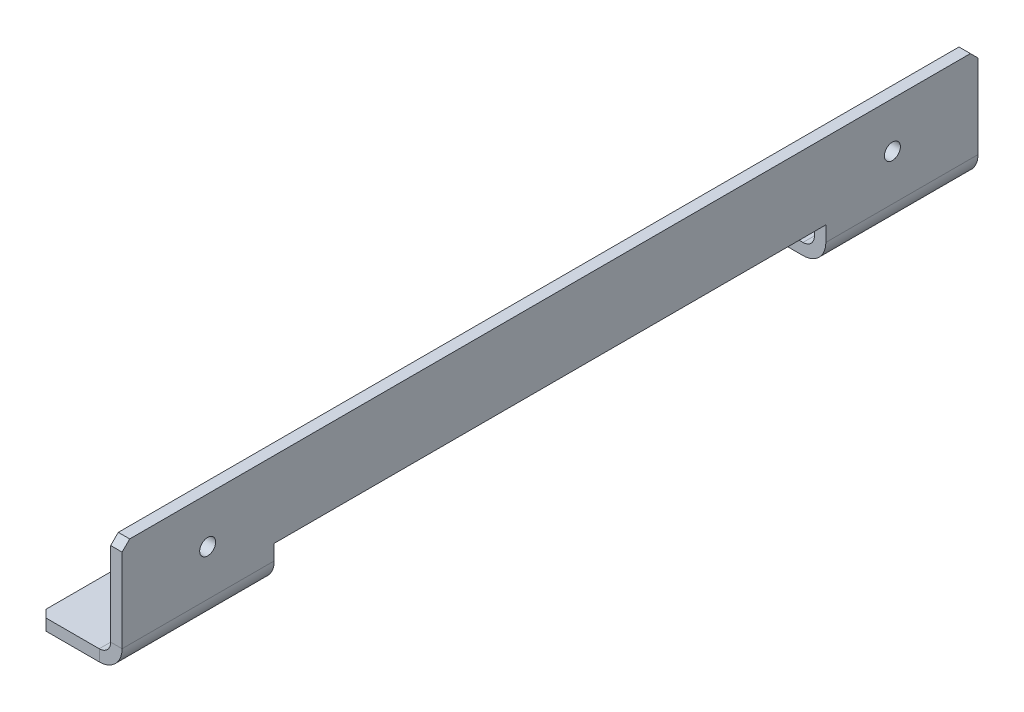
ISO-10303-21;
HEADER;
FILE_DESCRIPTION(('STEP AP214'),'2;1');
FILE_NAME('part.step','',(''),(''),'','','');
FILE_SCHEMA(('AUTOMOTIVE_DESIGN { 1 0 10303 214 1 1 1 1 }'));
ENDSEC;
DATA;
#1=APPLICATION_CONTEXT('core data for automotive mechanical design processes');
#2=APPLICATION_PROTOCOL_DEFINITION('international standard','automotive_design',2000,#1);
#3=PRODUCT_CONTEXT('',#1,'mechanical');
#4=PRODUCT('Part','Part','',(#3));
#5=PRODUCT_RELATED_PRODUCT_CATEGORY('part','',(#4));
#6=PRODUCT_DEFINITION_FORMATION('','',#4);
#7=PRODUCT_DEFINITION_CONTEXT('part definition',#1,'design');
#8=PRODUCT_DEFINITION('design','',#6,#7);
#9=PRODUCT_DEFINITION_SHAPE('','',#8);
#10=(LENGTH_UNIT() NAMED_UNIT(*) SI_UNIT(.MILLI.,.METRE.));
#11=(NAMED_UNIT(*) PLANE_ANGLE_UNIT() SI_UNIT($,.RADIAN.));
#12=(NAMED_UNIT(*) SI_UNIT($,.STERADIAN.) SOLID_ANGLE_UNIT());
#13=UNCERTAINTY_MEASURE_WITH_UNIT(LENGTH_MEASURE(1.E-05),#10,'distance_accuracy_value','');
#14=(GEOMETRIC_REPRESENTATION_CONTEXT(3) GLOBAL_UNCERTAINTY_ASSIGNED_CONTEXT((#13)) GLOBAL_UNIT_ASSIGNED_CONTEXT((#10,
#11,#12)) REPRESENTATION_CONTEXT('',''));
#15=CARTESIAN_POINT('',(0.,0.,0.));
#16=DIRECTION('',(0.,0.,1.));
#17=DIRECTION('',(1.,0.,0.));
#18=AXIS2_PLACEMENT_3D('',#15,#16,#17);
#19=CARTESIAN_POINT('',(0.,3.,112.5));
#20=DIRECTION('',(0.,-1.,0.));
#21=DIRECTION('',(1.,0.,0.));
#22=AXIS2_PLACEMENT_3D('',#19,#20,#21);
#23=PLANE('',#22);
#24=CARTESIAN_POINT('',(-14.,3.,90.));
#25=DIRECTION('',(0.,1.,0.));
#26=DIRECTION('',(-1.,0.,0.));
#27=AXIS2_PLACEMENT_3D('',#24,#25,#26);
#28=CIRCLE('',#27,2.75);
#29=CARTESIAN_POINT('',(-16.75,3.,90.));
#30=VERTEX_POINT('',#29);
#31=EDGE_CURVE('E242',#30,#30,#28,.T.);
#32=ORIENTED_EDGE('',*,*,#31,.F.);
#33=EDGE_LOOP('',(#32));
#34=FACE_BOUND('',#33,.T.);
#35=DIRECTION('',(0.,0.,-1.));
#36=VECTOR('',#35,1.);
#37=CARTESIAN_POINT('',(-22.,3.,112.5));
#38=LINE('',#37,#36);
#39=CARTESIAN_POINT('',(-22.,3.,110.5));
#40=VERTEX_POINT('',#39);
#41=CARTESIAN_POINT('',(-22.,3.,74.5));
#42=VERTEX_POINT('',#41);
#43=EDGE_CURVE('E304',#40,#42,#38,.T.);
#44=ORIENTED_EDGE('',*,*,#43,.F.);
#45=DIRECTION('',(-0.707106781186552,0.,-0.707106781186543));
#46=VECTOR('',#45,1.);
#47=CARTESIAN_POINT('',(-22.,3.,110.5));
#48=LINE('',#47,#46);
#49=CARTESIAN_POINT('',(-19.9999999999999,3.,112.5));
#50=VERTEX_POINT('',#49);
#51=EDGE_CURVE('E349',#40,#50,#48,.F.);
#52=ORIENTED_EDGE('',*,*,#51,.T.);
#53=DIRECTION('',(-1.,0.,0.));
#54=VECTOR('',#53,1.);
#55=CARTESIAN_POINT('',(0.,3.,112.5));
#56=LINE('',#55,#54);
#57=CARTESIAN_POINT('',(-6.,3.,112.5));
#58=VERTEX_POINT('',#57);
#59=EDGE_CURVE('E246',#58,#50,#56,.T.);
#60=ORIENTED_EDGE('',*,*,#59,.F.);
#61=DIRECTION('',(0.,0.,-1.));
#62=VECTOR('',#61,1.);
#63=CARTESIAN_POINT('',(-6.,3.,112.5));
#64=LINE('',#63,#62);
#65=CARTESIAN_POINT('',(-6.,3.,72.5));
#66=VERTEX_POINT('',#65);
#67=EDGE_CURVE('E278',#58,#66,#64,.T.);
#68=ORIENTED_EDGE('',*,*,#67,.T.);
#69=DIRECTION('',(-1.,0.,0.));
#70=VECTOR('',#69,1.);
#71=CARTESIAN_POINT('',(0.,3.,72.5));
#72=LINE('',#71,#70);
#73=CARTESIAN_POINT('',(-20.,3.,72.5));
#74=VERTEX_POINT('',#73);
#75=EDGE_CURVE('E232',#66,#74,#72,.T.);
#76=ORIENTED_EDGE('',*,*,#75,.T.);
#77=DIRECTION('',(-0.707106781186548,0.,0.707106781186548));
#78=VECTOR('',#77,1.);
#79=CARTESIAN_POINT('',(-20.,3.,72.5));
#80=LINE('',#79,#78);
#81=EDGE_CURVE('E347',#74,#42,#80,.T.);
#82=ORIENTED_EDGE('',*,*,#81,.T.);
#83=EDGE_LOOP('',(#44,#52,#60,#68,#76,#82));
#84=FACE_BOUND('',#83,.T.);
#85=ADVANCED_FACE('F39',(#34,#84),#23,.F.);
#86=CARTESIAN_POINT('',(-22.,0.,112.5));
#87=DIRECTION('',(-1.,0.,0.));
#88=DIRECTION('',(0.,0.,1.));
#89=AXIS2_PLACEMENT_3D('',#86,#87,#88);
#90=PLANE('',#89);
#91=DIRECTION('',(0.,0.,-1.));
#92=VECTOR('',#91,1.);
#93=CARTESIAN_POINT('',(-22.,0.,112.5));
#94=LINE('',#93,#92);
#95=CARTESIAN_POINT('',(-22.,0.,110.5));
#96=VERTEX_POINT('',#95);
#97=CARTESIAN_POINT('',(-22.,0.,74.5));
#98=VERTEX_POINT('',#97);
#99=EDGE_CURVE('E301',#96,#98,#94,.T.);
#100=ORIENTED_EDGE('',*,*,#99,.F.);
#101=DIRECTION('',(0.,1.,0.));
#102=VECTOR('',#101,1.);
#103=CARTESIAN_POINT('',(-22.,0.,110.5));
#104=LINE('',#103,#102);
#105=EDGE_CURVE('E344',#96,#40,#104,.T.);
#106=ORIENTED_EDGE('',*,*,#105,.T.);
#107=ORIENTED_EDGE('',*,*,#43,.T.);
#108=DIRECTION('',(0.,-1.,0.));
#109=VECTOR('',#108,1.);
#110=CARTESIAN_POINT('',(-22.,0.,74.5));
#111=LINE('',#110,#109);
#112=EDGE_CURVE('E342',#42,#98,#111,.T.);
#113=ORIENTED_EDGE('',*,*,#112,.T.);
#114=EDGE_LOOP('',(#100,#106,#107,#113));
#115=FACE_BOUND('',#114,.T.);
#116=ADVANCED_FACE('F460',(#115),#90,.T.);
#117=CARTESIAN_POINT('',(0.,0.,112.5));
#118=DIRECTION('',(0.,-1.,0.));
#119=DIRECTION('',(1.,0.,0.));
#120=AXIS2_PLACEMENT_3D('',#117,#118,#119);
#121=PLANE('',#120);
#122=DIRECTION('',(-1.,0.,0.));
#123=VECTOR('',#122,1.);
#124=CARTESIAN_POINT('',(0.,0.,112.5));
#125=LINE('',#124,#123);
#126=CARTESIAN_POINT('',(-6.,0.,112.5));
#127=VERTEX_POINT('',#126);
#128=CARTESIAN_POINT('',(-19.9999999999999,0.,112.5));
#129=VERTEX_POINT('',#128);
#130=EDGE_CURVE('E249',#127,#129,#125,.T.);
#131=ORIENTED_EDGE('',*,*,#130,.T.);
#132=DIRECTION('',(0.707106781186552,0.,0.707106781186543));
#133=VECTOR('',#132,1.);
#134=CARTESIAN_POINT('',(-9.99999999999983,0.,122.5));
#135=LINE('',#134,#133);
#136=EDGE_CURVE('E355',#129,#96,#135,.F.);
#137=ORIENTED_EDGE('',*,*,#136,.T.);
#138=ORIENTED_EDGE('',*,*,#99,.T.);
#139=DIRECTION('',(0.707106781186548,0.,-0.707106781186548));
#140=VECTOR('',#139,1.);
#141=CARTESIAN_POINT('',(-30.,0.,82.5));
#142=LINE('',#141,#140);
#143=CARTESIAN_POINT('',(-20.,0.,72.5));
#144=VERTEX_POINT('',#143);
#145=EDGE_CURVE('E353',#98,#144,#142,.T.);
#146=ORIENTED_EDGE('',*,*,#145,.T.);
#147=DIRECTION('',(1.,0.,0.));
#148=VECTOR('',#147,1.);
#149=CARTESIAN_POINT('',(-70.,0.,72.5));
#150=LINE('',#149,#148);
#151=CARTESIAN_POINT('',(-6.00000000000001,0.,72.5));
#152=VERTEX_POINT('',#151);
#153=EDGE_CURVE('E217',#144,#152,#150,.T.);
#154=ORIENTED_EDGE('',*,*,#153,.T.);
#155=DIRECTION('',(0.,0.,-1.));
#156=VECTOR('',#155,1.);
#157=CARTESIAN_POINT('',(-6.,0.,112.5));
#158=LINE('',#157,#156);
#159=EDGE_CURVE('E295',#127,#152,#158,.T.);
#160=ORIENTED_EDGE('',*,*,#159,.F.);
#161=EDGE_LOOP('',(#131,#137,#138,#146,#154,#160));
#162=FACE_BOUND('',#161,.T.);
#163=CARTESIAN_POINT('',(-14.,0.,90.));
#164=DIRECTION('',(0.,-1.,0.));
#165=DIRECTION('',(1.,0.,0.));
#166=AXIS2_PLACEMENT_3D('',#163,#164,#165);
#167=CIRCLE('',#166,2.75);
#168=CARTESIAN_POINT('',(-11.25,0.,90.));
#169=VERTEX_POINT('',#168);
#170=EDGE_CURVE('E245',#169,#169,#167,.T.);
#171=ORIENTED_EDGE('',*,*,#170,.F.);
#172=EDGE_LOOP('',(#171));
#173=FACE_BOUND('',#172,.T.);
#174=ADVANCED_FACE('F446',(#162,#173),#121,.T.);
#175=CARTESIAN_POINT('',(-6.,6.,112.5));
#176=DIRECTION('',(0.,0.,-1.));
#177=DIRECTION('',(-1.,0.,0.));
#178=AXIS2_PLACEMENT_3D('',#175,#176,#177);
#179=CYLINDRICAL_SURFACE('',#178,6.);
#180=CARTESIAN_POINT('',(-6.,6.,72.5));
#181=DIRECTION('',(0.,0.,1.));
#182=DIRECTION('',(1.,0.,0.));
#183=AXIS2_PLACEMENT_3D('',#180,#181,#182);
#184=CIRCLE('',#183,6.);
#185=CARTESIAN_POINT('',(0.,6.,72.5));
#186=VERTEX_POINT('',#185);
#187=EDGE_CURVE('E235',#186,#152,#184,.F.);
#188=ORIENTED_EDGE('',*,*,#187,.F.);
#189=DIRECTION('',(0.,0.,-1.));
#190=VECTOR('',#189,1.);
#191=CARTESIAN_POINT('',(0.,6.,112.5));
#192=LINE('',#191,#190);
#193=CARTESIAN_POINT('',(0.,6.,112.5));
#194=VERTEX_POINT('',#193);
#195=EDGE_CURVE('E292',#194,#186,#192,.T.);
#196=ORIENTED_EDGE('',*,*,#195,.F.);
#197=CARTESIAN_POINT('',(-6.,6.,112.5));
#198=DIRECTION('',(0.,0.,1.));
#199=DIRECTION('',(1.,0.,0.));
#200=AXIS2_PLACEMENT_3D('',#197,#198,#199);
#201=CIRCLE('',#200,6.);
#202=EDGE_CURVE('E253',#194,#127,#201,.F.);
#203=ORIENTED_EDGE('',*,*,#202,.T.);
#204=ORIENTED_EDGE('',*,*,#159,.T.);
#205=EDGE_LOOP('',(#188,#196,#203,#204));
#206=FACE_BOUND('',#205,.T.);
#207=ADVANCED_FACE('F438',(#206),#179,.T.);
#208=CARTESIAN_POINT('',(-6.,6.,112.5));
#209=DIRECTION('',(0.,0.,-1.));
#210=DIRECTION('',(-1.,0.,0.));
#211=AXIS2_PLACEMENT_3D('',#208,#209,#210);
#212=CYLINDRICAL_SURFACE('',#211,3.);
#213=DIRECTION('',(0.,0.,-1.));
#214=VECTOR('',#213,1.);
#215=CARTESIAN_POINT('',(-3.,6.,112.5));
#216=LINE('',#215,#214);
#217=CARTESIAN_POINT('',(-3.,6.,112.5));
#218=VERTEX_POINT('',#217);
#219=CARTESIAN_POINT('',(-3.,6.,72.5));
#220=VERTEX_POINT('',#219);
#221=EDGE_CURVE('E282',#218,#220,#216,.T.);
#222=ORIENTED_EDGE('',*,*,#221,.T.);
#223=CARTESIAN_POINT('',(-6.,6.,72.5));
#224=DIRECTION('',(0.,0.,1.));
#225=DIRECTION('',(1.,0.,0.));
#226=AXIS2_PLACEMENT_3D('',#223,#224,#225);
#227=CIRCLE('',#226,3.);
#228=EDGE_CURVE('E323',#220,#66,#227,.F.);
#229=ORIENTED_EDGE('',*,*,#228,.T.);
#230=ORIENTED_EDGE('',*,*,#67,.F.);
#231=CARTESIAN_POINT('',(-6.,6.,112.5));
#232=DIRECTION('',(0.,0.,1.));
#233=DIRECTION('',(1.,0.,0.));
#234=AXIS2_PLACEMENT_3D('',#231,#232,#233);
#235=CIRCLE('',#234,3.);
#236=EDGE_CURVE('E260',#218,#58,#235,.F.);
#237=ORIENTED_EDGE('',*,*,#236,.F.);
#238=EDGE_LOOP('',(#222,#229,#230,#237));
#239=FACE_BOUND('',#238,.T.);
#240=ADVANCED_FACE('F533',(#239),#212,.F.);
#241=CARTESIAN_POINT('',(-6.,0.,112.5));
#242=DIRECTION('',(0.,0.,1.));
#243=DIRECTION('',(1.,0.,0.));
#244=AXIS2_PLACEMENT_3D('',#241,#242,#243);
#245=PLANE('',#244);
#246=DIRECTION('',(0.,1.,0.));
#247=VECTOR('',#246,1.);
#248=CARTESIAN_POINT('',(-6.,0.,112.5));
#249=LINE('',#248,#247);
#250=EDGE_CURVE('E314',#127,#58,#249,.T.);
#251=ORIENTED_EDGE('',*,*,#250,.F.);
#252=ORIENTED_EDGE('',*,*,#202,.F.);
#253=DIRECTION('',(1.,0.,0.));
#254=VECTOR('',#253,1.);
#255=CARTESIAN_POINT('',(-3.,6.,112.5));
#256=LINE('',#255,#254);
#257=EDGE_CURVE('E311',#218,#194,#256,.T.);
#258=ORIENTED_EDGE('',*,*,#257,.F.);
#259=ORIENTED_EDGE('',*,*,#236,.T.);
#260=EDGE_LOOP('',(#251,#252,#258,#259));
#261=FACE_BOUND('',#260,.T.);
#262=ADVANCED_FACE('F439',(#261),#245,.T.);
#263=CARTESIAN_POINT('',(-3.,6.,112.5));
#264=DIRECTION('',(0.,0.,1.));
#265=DIRECTION('',(1.,0.,0.));
#266=AXIS2_PLACEMENT_3D('',#263,#264,#265);
#267=PLANE('',#266);
#268=ORIENTED_EDGE('',*,*,#59,.T.);
#269=DIRECTION('',(0.,-1.,0.));
#270=VECTOR('',#269,1.);
#271=CARTESIAN_POINT('',(-19.9999999999999,6.,112.5));
#272=LINE('',#271,#270);
#273=EDGE_CURVE('E351',#50,#129,#272,.T.);
#274=ORIENTED_EDGE('',*,*,#273,.T.);
#275=ORIENTED_EDGE('',*,*,#130,.F.);
#276=ORIENTED_EDGE('',*,*,#250,.T.);
#277=EDGE_LOOP('',(#268,#274,#275,#276));
#278=FACE_BOUND('',#277,.T.);
#279=ADVANCED_FACE('F450',(#278),#267,.T.);
#280=CARTESIAN_POINT('',(0.,6.,-112.5));
#281=DIRECTION('',(0.,0.,-1.));
#282=DIRECTION('',(-1.,0.,0.));
#283=AXIS2_PLACEMENT_3D('',#280,#281,#282);
#284=PLANE('',#283);
#285=DIRECTION('',(-1.,0.,0.));
#286=VECTOR('',#285,1.);
#287=CARTESIAN_POINT('',(0.,6.,-112.5));
#288=LINE('',#287,#286);
#289=CARTESIAN_POINT('',(0.,6.,-112.5));
#290=VERTEX_POINT('',#289);
#291=CARTESIAN_POINT('',(-3.,6.,-112.5));
#292=VERTEX_POINT('',#291);
#293=EDGE_CURVE('E308',#290,#292,#288,.T.);
#294=ORIENTED_EDGE('',*,*,#293,.F.);
#295=CARTESIAN_POINT('',(-6.,6.,-112.5));
#296=DIRECTION('',(0.,0.,1.));
#297=DIRECTION('',(1.,0.,0.));
#298=AXIS2_PLACEMENT_3D('',#295,#296,#297);
#299=CIRCLE('',#298,6.);
#300=CARTESIAN_POINT('',(-6.,0.,-112.5));
#301=VERTEX_POINT('',#300);
#302=EDGE_CURVE('E269',#290,#301,#299,.F.);
#303=ORIENTED_EDGE('',*,*,#302,.T.);
#304=DIRECTION('',(0.,-1.,0.));
#305=VECTOR('',#304,1.);
#306=CARTESIAN_POINT('',(-6.,3.,-112.5));
#307=LINE('',#306,#305);
#308=CARTESIAN_POINT('',(-6.,3.,-112.5));
#309=VERTEX_POINT('',#308);
#310=EDGE_CURVE('E305',#309,#301,#307,.T.);
#311=ORIENTED_EDGE('',*,*,#310,.F.);
#312=CARTESIAN_POINT('',(-6.,6.,-112.5));
#313=DIRECTION('',(0.,0.,1.));
#314=DIRECTION('',(1.,0.,0.));
#315=AXIS2_PLACEMENT_3D('',#312,#313,#314);
#316=CIRCLE('',#315,3.);
#317=EDGE_CURVE('E250',#292,#309,#316,.F.);
#318=ORIENTED_EDGE('',*,*,#317,.F.);
#319=EDGE_LOOP('',(#294,#303,#311,#318));
#320=FACE_BOUND('',#319,.T.);
#321=ADVANCED_FACE('F400',(#320),#284,.T.);
#322=CARTESIAN_POINT('',(-6.,3.,-112.5));
#323=DIRECTION('',(0.,0.,-1.));
#324=DIRECTION('',(-1.,0.,0.));
#325=AXIS2_PLACEMENT_3D('',#322,#323,#324);
#326=PLANE('',#325);
#327=DIRECTION('',(0.,-1.,0.));
#328=VECTOR('',#327,1.);
#329=CARTESIAN_POINT('',(-3.,30.,-112.5));
#330=LINE('',#329,#328);
#331=CARTESIAN_POINT('',(-3.,28.,-112.5));
#332=VERTEX_POINT('',#331);
#333=EDGE_CURVE('E274',#332,#292,#330,.T.);
#334=ORIENTED_EDGE('',*,*,#333,.F.);
#335=DIRECTION('',(1.,0.,0.));
#336=VECTOR('',#335,1.);
#337=CARTESIAN_POINT('',(-6.,28.,-112.5));
#338=LINE('',#337,#336);
#339=CARTESIAN_POINT('',(0.,27.9999999999999,-112.5));
#340=VERTEX_POINT('',#339);
#341=EDGE_CURVE('E360',#332,#340,#338,.T.);
#342=ORIENTED_EDGE('',*,*,#341,.T.);
#343=DIRECTION('',(0.,-1.,0.));
#344=VECTOR('',#343,1.);
#345=CARTESIAN_POINT('',(0.,30.,-112.5));
#346=LINE('',#345,#344);
#347=EDGE_CURVE('E272',#340,#290,#346,.T.);
#348=ORIENTED_EDGE('',*,*,#347,.T.);
#349=ORIENTED_EDGE('',*,*,#293,.T.);
#350=EDGE_LOOP('',(#334,#342,#348,#349));
#351=FACE_BOUND('',#350,.T.);
#352=ADVANCED_FACE('F409',(#351),#326,.T.);
#353=CARTESIAN_POINT('',(-14.,3.,-90.));
#354=DIRECTION('',(0.,1.,0.));
#355=DIRECTION('',(1.,0.,0.));
#356=AXIS2_PLACEMENT_3D('',#353,#354,#355);
#357=CIRCLE('',#356,2.75000000000001);
#358=CARTESIAN_POINT('',(-11.25,3.,-90.));
#359=VERTEX_POINT('',#358);
#360=EDGE_CURVE('E238',#359,#359,#357,.T.);
#361=ORIENTED_EDGE('',*,*,#360,.F.);
#362=EDGE_LOOP('',(#361));
#363=FACE_BOUND('',#362,.T.);
#364=CARTESIAN_POINT('',(-22.,3.,-74.4999999999999));
#365=VERTEX_POINT('',#364);
#366=CARTESIAN_POINT('',(-22.,3.,-110.5));
#367=VERTEX_POINT('',#366);
#368=EDGE_CURVE('E302',#365,#367,#38,.T.);
#369=ORIENTED_EDGE('',*,*,#368,.F.);
#370=DIRECTION('',(0.70710678118655,0.,0.707106781186545));
#371=VECTOR('',#370,1.);
#372=CARTESIAN_POINT('',(-20.,3.,-72.5));
#373=LINE('',#372,#371);
#374=CARTESIAN_POINT('',(-20.,3.,-72.5));
#375=VERTEX_POINT('',#374);
#376=EDGE_CURVE('E48',#365,#375,#373,.T.);
#377=ORIENTED_EDGE('',*,*,#376,.T.);
#378=DIRECTION('',(1.,0.,0.));
#379=VECTOR('',#378,1.);
#380=CARTESIAN_POINT('',(0.,3.,-72.5));
#381=LINE('',#380,#379);
#382=CARTESIAN_POINT('',(-6.,3.,-72.5));
#383=VERTEX_POINT('',#382);
#384=EDGE_CURVE('E226',#375,#383,#381,.T.);
#385=ORIENTED_EDGE('',*,*,#384,.T.);
#386=EDGE_CURVE('E263',#383,#309,#64,.T.);
#387=ORIENTED_EDGE('',*,*,#386,.T.);
#388=DIRECTION('',(-1.,0.,0.));
#389=VECTOR('',#388,1.);
#390=CARTESIAN_POINT('',(0.,3.,-112.5));
#391=LINE('',#390,#389);
#392=CARTESIAN_POINT('',(-20.,3.,-112.5));
#393=VERTEX_POINT('',#392);
#394=EDGE_CURVE('E264',#309,#393,#391,.T.);
#395=ORIENTED_EDGE('',*,*,#394,.T.);
#396=DIRECTION('',(-0.707106781186548,0.,0.707106781186548));
#397=VECTOR('',#396,1.);
#398=CARTESIAN_POINT('',(-20.,3.,-112.5));
#399=LINE('',#398,#397);
#400=EDGE_CURVE('E55',#393,#367,#399,.T.);
#401=ORIENTED_EDGE('',*,*,#400,.T.);
#402=EDGE_LOOP('',(#369,#377,#385,#387,#395,#401));
#403=FACE_BOUND('',#402,.T.);
#404=ADVANCED_FACE('F376',(#363,#403),#23,.F.);
#405=CARTESIAN_POINT('',(-22.,0.,-74.5));
#406=VERTEX_POINT('',#405);
#407=CARTESIAN_POINT('',(-22.,0.,-110.5));
#408=VERTEX_POINT('',#407);
#409=EDGE_CURVE('E298',#406,#408,#94,.T.);
#410=ORIENTED_EDGE('',*,*,#409,.F.);
#411=DIRECTION('',(0.,1.,0.));
#412=VECTOR('',#411,1.);
#413=CARTESIAN_POINT('',(-22.,3.,-74.5));
#414=LINE('',#413,#412);
#415=EDGE_CURVE('E372',#406,#365,#414,.T.);
#416=ORIENTED_EDGE('',*,*,#415,.T.);
#417=ORIENTED_EDGE('',*,*,#368,.T.);
#418=DIRECTION('',(0.,-1.,0.));
#419=VECTOR('',#418,1.);
#420=CARTESIAN_POINT('',(-22.,0.,-110.5));
#421=LINE('',#420,#419);
#422=EDGE_CURVE('E370',#367,#408,#421,.T.);
#423=ORIENTED_EDGE('',*,*,#422,.T.);
#424=EDGE_LOOP('',(#410,#416,#417,#423));
#425=FACE_BOUND('',#424,.T.);
#426=ADVANCED_FACE('F391',(#425),#90,.T.);
#427=DIRECTION('',(1.,0.,0.));
#428=VECTOR('',#427,1.);
#429=CARTESIAN_POINT('',(-70.,0.,-72.5));
#430=LINE('',#429,#428);
#431=CARTESIAN_POINT('',(-20.0000000000001,0.,-72.5));
#432=VERTEX_POINT('',#431);
#433=CARTESIAN_POINT('',(-6.00000000000001,0.,-72.5));
#434=VERTEX_POINT('',#433);
#435=EDGE_CURVE('E201',#432,#434,#430,.T.);
#436=ORIENTED_EDGE('',*,*,#435,.F.);
#437=DIRECTION('',(-0.70710678118655,0.,-0.707106781186545));
#438=VECTOR('',#437,1.);
#439=CARTESIAN_POINT('',(82.5000000000001,0.,29.9999999999994));
#440=LINE('',#439,#438);
#441=EDGE_CURVE('E368',#432,#406,#440,.T.);
#442=ORIENTED_EDGE('',*,*,#441,.T.);
#443=ORIENTED_EDGE('',*,*,#409,.T.);
#444=DIRECTION('',(0.707106781186548,0.,-0.707106781186548));
#445=VECTOR('',#444,1.);
#446=CARTESIAN_POINT('',(-122.5,0.,-9.99999999999998));
#447=LINE('',#446,#445);
#448=CARTESIAN_POINT('',(-19.9999999999999,0.,-112.5));
#449=VERTEX_POINT('',#448);
#450=EDGE_CURVE('E366',#408,#449,#447,.T.);
#451=ORIENTED_EDGE('',*,*,#450,.T.);
#452=DIRECTION('',(-1.,0.,0.));
#453=VECTOR('',#452,1.);
#454=CARTESIAN_POINT('',(0.,0.,-112.5));
#455=LINE('',#454,#453);
#456=EDGE_CURVE('E266',#301,#449,#455,.T.);
#457=ORIENTED_EDGE('',*,*,#456,.F.);
#458=EDGE_CURVE('E294',#434,#301,#158,.T.);
#459=ORIENTED_EDGE('',*,*,#458,.F.);
#460=EDGE_LOOP('',(#436,#442,#443,#451,#457,#459));
#461=FACE_BOUND('',#460,.T.);
#462=CARTESIAN_POINT('',(-14.,0.,-90.));
#463=DIRECTION('',(0.,-1.,0.));
#464=DIRECTION('',(1.,0.,0.));
#465=AXIS2_PLACEMENT_3D('',#462,#463,#464);
#466=CIRCLE('',#465,2.75000000000001);
#467=CARTESIAN_POINT('',(-11.25,0.,-90.));
#468=VERTEX_POINT('',#467);
#469=EDGE_CURVE('E241',#468,#468,#466,.T.);
#470=ORIENTED_EDGE('',*,*,#469,.F.);
#471=EDGE_LOOP('',(#470));
#472=FACE_BOUND('',#471,.T.);
#473=ADVANCED_FACE('F386',(#461,#472),#121,.T.);
#474=CARTESIAN_POINT('',(-6.,6.,-72.5));
#475=DIRECTION('',(0.,0.,-1.));
#476=DIRECTION('',(-1.,0.,0.));
#477=AXIS2_PLACEMENT_3D('',#474,#475,#476);
#478=CIRCLE('',#477,6.);
#479=CARTESIAN_POINT('',(0.,6.,-72.5));
#480=VERTEX_POINT('',#479);
#481=EDGE_CURVE('E208',#434,#480,#478,.F.);
#482=ORIENTED_EDGE('',*,*,#481,.F.);
#483=ORIENTED_EDGE('',*,*,#458,.T.);
#484=ORIENTED_EDGE('',*,*,#302,.F.);
#485=EDGE_CURVE('E291',#480,#290,#192,.T.);
#486=ORIENTED_EDGE('',*,*,#485,.F.);
#487=EDGE_LOOP('',(#482,#483,#484,#486));
#488=FACE_BOUND('',#487,.T.);
#489=ADVANCED_FACE('F413',(#488),#179,.T.);
#490=CARTESIAN_POINT('',(0.,30.,112.5));
#491=DIRECTION('',(1.,0.,0.));
#492=DIRECTION('',(0.,1.,0.));
#493=AXIS2_PLACEMENT_3D('',#490,#491,#492);
#494=PLANE('',#493);
#495=CARTESIAN_POINT('',(0.,18.,90.));
#496=DIRECTION('',(1.,0.,0.));
#497=DIRECTION('',(0.,0.,-1.));
#498=AXIS2_PLACEMENT_3D('',#495,#496,#497);
#499=CIRCLE('',#498,2.09999999999999);
#500=CARTESIAN_POINT('',(0.,18.,87.9));
#501=VERTEX_POINT('',#500);
#502=EDGE_CURVE('E476',#501,#501,#499,.T.);
#503=ORIENTED_EDGE('',*,*,#502,.F.);
#504=EDGE_LOOP('',(#503));
#505=FACE_BOUND('',#504,.T.);
#506=CARTESIAN_POINT('',(0.,18.,-90.));
#507=DIRECTION('',(1.,0.,0.));
#508=DIRECTION('',(0.,0.,-1.));
#509=AXIS2_PLACEMENT_3D('',#506,#507,#508);
#510=CIRCLE('',#509,2.09999999999999);
#511=CARTESIAN_POINT('',(0.,18.,-92.1));
#512=VERTEX_POINT('',#511);
#513=EDGE_CURVE('E471',#512,#512,#510,.T.);
#514=ORIENTED_EDGE('',*,*,#513,.F.);
#515=EDGE_LOOP('',(#514));
#516=FACE_BOUND('',#515,.T.);
#517=DIRECTION('',(0.,0.,-1.));
#518=VECTOR('',#517,1.);
#519=CARTESIAN_POINT('',(0.,30.,112.5));
#520=LINE('',#519,#518);
#521=CARTESIAN_POINT('',(0.,30.,110.5));
#522=VERTEX_POINT('',#521);
#523=CARTESIAN_POINT('',(0.,30.,-110.5));
#524=VERTEX_POINT('',#523);
#525=EDGE_CURVE('E288',#522,#524,#520,.T.);
#526=ORIENTED_EDGE('',*,*,#525,.F.);
#527=DIRECTION('',(0.,0.707106781186552,-0.707106781186543));
#528=VECTOR('',#527,1.);
#529=CARTESIAN_POINT('',(0.,29.,111.5));
#530=LINE('',#529,#528);
#531=CARTESIAN_POINT('',(0.,27.9999999999999,112.5));
#532=VERTEX_POINT('',#531);
#533=EDGE_CURVE('E334',#522,#532,#530,.F.);
#534=ORIENTED_EDGE('',*,*,#533,.T.);
#535=DIRECTION('',(0.,-1.,0.));
#536=VECTOR('',#535,1.);
#537=CARTESIAN_POINT('',(0.,30.,112.5));
#538=LINE('',#537,#536);
#539=EDGE_CURVE('E256',#532,#194,#538,.T.);
#540=ORIENTED_EDGE('',*,*,#539,.T.);
#541=ORIENTED_EDGE('',*,*,#195,.T.);
#542=DIRECTION('',(0.,-1.,0.));
#543=VECTOR('',#542,1.);
#544=CARTESIAN_POINT('',(0.,0.,72.5));
#545=LINE('',#544,#543);
#546=CARTESIAN_POINT('',(0.,10.,72.5));
#547=VERTEX_POINT('',#546);
#548=EDGE_CURVE('E212',#547,#186,#545,.T.);
#549=ORIENTED_EDGE('',*,*,#548,.F.);
#550=DIRECTION('',(0.,0.,1.));
#551=VECTOR('',#550,1.);
#552=CARTESIAN_POINT('',(0.,10.,72.5));
#553=LINE('',#552,#551);
#554=CARTESIAN_POINT('',(0.,10.,-72.5));
#555=VERTEX_POINT('',#554);
#556=EDGE_CURVE('E194',#555,#547,#553,.T.);
#557=ORIENTED_EDGE('',*,*,#556,.F.);
#558=DIRECTION('',(0.,1.,0.));
#559=VECTOR('',#558,1.);
#560=CARTESIAN_POINT('',(0.,0.,-72.5));
#561=LINE('',#560,#559);
#562=EDGE_CURVE('E204',#480,#555,#561,.T.);
#563=ORIENTED_EDGE('',*,*,#562,.F.);
#564=ORIENTED_EDGE('',*,*,#485,.T.);
#565=ORIENTED_EDGE('',*,*,#347,.F.);
#566=DIRECTION('',(0.,-0.707106781186548,-0.707106781186548));
#567=VECTOR('',#566,1.);
#568=CARTESIAN_POINT('',(0.,141.5,1.00000000000001));
#569=LINE('',#568,#567);
#570=EDGE_CURVE('E332',#340,#524,#569,.F.);
#571=ORIENTED_EDGE('',*,*,#570,.T.);
#572=EDGE_LOOP('',(#526,#534,#540,#541,#549,#557,#563,#564,#565,#571));
#573=FACE_BOUND('',#572,.T.);
#574=ADVANCED_FACE('F215',(#505,#516,#573),#494,.T.);
#575=CARTESIAN_POINT('',(-3.,30.,112.5));
#576=DIRECTION('',(0.,1.,0.));
#577=DIRECTION('',(0.,0.,1.));
#578=AXIS2_PLACEMENT_3D('',#575,#576,#577);
#579=PLANE('',#578);
#580=DIRECTION('',(0.,0.,-1.));
#581=VECTOR('',#580,1.);
#582=CARTESIAN_POINT('',(-3.,30.,112.5));
#583=LINE('',#582,#581);
#584=CARTESIAN_POINT('',(-3.,30.,110.5));
#585=VERTEX_POINT('',#584);
#586=CARTESIAN_POINT('',(-3.,30.,-110.5));
#587=VERTEX_POINT('',#586);
#588=EDGE_CURVE('E285',#585,#587,#583,.T.);
#589=ORIENTED_EDGE('',*,*,#588,.F.);
#590=DIRECTION('',(1.,0.,0.));
#591=VECTOR('',#590,1.);
#592=CARTESIAN_POINT('',(-3.,30.,110.5));
#593=LINE('',#592,#591);
#594=EDGE_CURVE('E329',#585,#522,#593,.T.);
#595=ORIENTED_EDGE('',*,*,#594,.T.);
#596=ORIENTED_EDGE('',*,*,#525,.T.);
#597=DIRECTION('',(-1.,0.,0.));
#598=VECTOR('',#597,1.);
#599=CARTESIAN_POINT('',(-3.,30.,-110.5));
#600=LINE('',#599,#598);
#601=EDGE_CURVE('E327',#524,#587,#600,.T.);
#602=ORIENTED_EDGE('',*,*,#601,.T.);
#603=EDGE_LOOP('',(#589,#595,#596,#602));
#604=FACE_BOUND('',#603,.T.);
#605=ADVANCED_FACE('F418',(#604),#579,.T.);
#606=CARTESIAN_POINT('',(-3.,30.,112.5));
#607=DIRECTION('',(1.,0.,0.));
#608=DIRECTION('',(0.,1.,0.));
#609=AXIS2_PLACEMENT_3D('',#606,#607,#608);
#610=PLANE('',#609);
#611=CARTESIAN_POINT('',(-3.,18.,90.));
#612=DIRECTION('',(1.,0.,0.));
#613=DIRECTION('',(0.,1.,0.));
#614=AXIS2_PLACEMENT_3D('',#611,#612,#613);
#615=CIRCLE('',#614,2.09999999999999);
#616=CARTESIAN_POINT('',(-3.,20.1,90.));
#617=VERTEX_POINT('',#616);
#618=EDGE_CURVE('E43',#617,#617,#615,.T.);
#619=ORIENTED_EDGE('',*,*,#618,.T.);
#620=EDGE_LOOP('',(#619));
#621=FACE_BOUND('',#620,.T.);
#622=CARTESIAN_POINT('',(-3.,18.,-90.));
#623=DIRECTION('',(1.,0.,0.));
#624=DIRECTION('',(0.,1.,0.));
#625=AXIS2_PLACEMENT_3D('',#622,#623,#624);
#626=CIRCLE('',#625,2.09999999999999);
#627=CARTESIAN_POINT('',(-3.,20.1,-90.));
#628=VERTEX_POINT('',#627);
#629=EDGE_CURVE('E469',#628,#628,#626,.T.);
#630=ORIENTED_EDGE('',*,*,#629,.T.);
#631=EDGE_LOOP('',(#630));
#632=FACE_BOUND('',#631,.T.);
#633=DIRECTION('',(0.,-1.,0.));
#634=VECTOR('',#633,1.);
#635=CARTESIAN_POINT('',(-3.,30.,112.5));
#636=LINE('',#635,#634);
#637=CARTESIAN_POINT('',(-3.,27.9999999999999,112.5));
#638=VERTEX_POINT('',#637);
#639=EDGE_CURVE('E258',#638,#218,#636,.T.);
#640=ORIENTED_EDGE('',*,*,#639,.F.);
#641=DIRECTION('',(0.,-0.707106781186552,0.707106781186543));
#642=VECTOR('',#641,1.);
#643=CARTESIAN_POINT('',(-3.,30.,110.5));
#644=LINE('',#643,#642);
#645=EDGE_CURVE('E340',#638,#585,#644,.F.);
#646=ORIENTED_EDGE('',*,*,#645,.T.);
#647=ORIENTED_EDGE('',*,*,#588,.T.);
#648=DIRECTION('',(0.,0.707106781186548,0.707106781186548));
#649=VECTOR('',#648,1.);
#650=CARTESIAN_POINT('',(-3.,28.,-112.5));
#651=LINE('',#650,#649);
#652=EDGE_CURVE('E338',#587,#332,#651,.F.);
#653=ORIENTED_EDGE('',*,*,#652,.T.);
#654=ORIENTED_EDGE('',*,*,#333,.T.);
#655=CARTESIAN_POINT('',(-3.,6.,-72.5));
#656=VERTEX_POINT('',#655);
#657=EDGE_CURVE('E281',#656,#292,#216,.T.);
#658=ORIENTED_EDGE('',*,*,#657,.F.);
#659=DIRECTION('',(0.,1.,0.));
#660=VECTOR('',#659,1.);
#661=CARTESIAN_POINT('',(-3.,30.,-72.5));
#662=LINE('',#661,#660);
#663=CARTESIAN_POINT('',(-3.,10.,-72.5));
#664=VERTEX_POINT('',#663);
#665=EDGE_CURVE('E222',#656,#664,#662,.T.);
#666=ORIENTED_EDGE('',*,*,#665,.T.);
#667=DIRECTION('',(0.,0.,1.));
#668=VECTOR('',#667,1.);
#669=CARTESIAN_POINT('',(-3.,10.,112.5));
#670=LINE('',#669,#668);
#671=CARTESIAN_POINT('',(-3.,10.,72.5));
#672=VERTEX_POINT('',#671);
#673=EDGE_CURVE('E197',#664,#672,#670,.T.);
#674=ORIENTED_EDGE('',*,*,#673,.T.);
#675=DIRECTION('',(0.,-1.,0.));
#676=VECTOR('',#675,1.);
#677=CARTESIAN_POINT('',(-3.,30.,72.5));
#678=LINE('',#677,#676);
#679=EDGE_CURVE('E229',#672,#220,#678,.T.);
#680=ORIENTED_EDGE('',*,*,#679,.T.);
#681=ORIENTED_EDGE('',*,*,#221,.F.);
#682=EDGE_LOOP('',(#640,#646,#647,#653,#654,#658,#666,#674,#680,#681));
#683=FACE_BOUND('',#682,.T.);
#684=ADVANCED_FACE('F423',(#621,#632,#683),#610,.F.);
#685=ORIENTED_EDGE('',*,*,#386,.F.);
#686=CARTESIAN_POINT('',(-6.,6.,-72.5));
#687=DIRECTION('',(0.,0.,-1.));
#688=DIRECTION('',(-1.,0.,0.));
#689=AXIS2_PLACEMENT_3D('',#686,#687,#688);
#690=CIRCLE('',#689,3.);
#691=EDGE_CURVE('E316',#383,#656,#690,.F.);
#692=ORIENTED_EDGE('',*,*,#691,.T.);
#693=ORIENTED_EDGE('',*,*,#657,.T.);
#694=ORIENTED_EDGE('',*,*,#317,.T.);
#695=EDGE_LOOP('',(#685,#692,#693,#694));
#696=FACE_BOUND('',#695,.T.);
#697=ADVANCED_FACE('F404',(#696),#212,.F.);
#698=CARTESIAN_POINT('',(-6.,6.,112.5));
#699=DIRECTION('',(0.,0.,1.));
#700=DIRECTION('',(1.,0.,0.));
#701=AXIS2_PLACEMENT_3D('',#698,#699,#700);
#702=PLANE('',#701);
#703=ORIENTED_EDGE('',*,*,#539,.F.);
#704=DIRECTION('',(-1.,0.,0.));
#705=VECTOR('',#704,1.);
#706=CARTESIAN_POINT('',(-6.,27.9999999999999,112.5));
#707=LINE('',#706,#705);
#708=EDGE_CURVE('E336',#532,#638,#707,.T.);
#709=ORIENTED_EDGE('',*,*,#708,.T.);
#710=ORIENTED_EDGE('',*,*,#639,.T.);
#711=ORIENTED_EDGE('',*,*,#257,.T.);
#712=EDGE_LOOP('',(#703,#709,#710,#711));
#713=FACE_BOUND('',#712,.T.);
#714=ADVANCED_FACE('F430',(#713),#702,.T.);
#715=CARTESIAN_POINT('',(-6.,6.,-112.5));
#716=DIRECTION('',(0.,0.,1.));
#717=DIRECTION('',(1.,0.,0.));
#718=AXIS2_PLACEMENT_3D('',#715,#716,#717);
#719=PLANE('',#718);
#720=ORIENTED_EDGE('',*,*,#456,.T.);
#721=DIRECTION('',(0.,1.,0.));
#722=VECTOR('',#721,1.);
#723=CARTESIAN_POINT('',(-20.,3.,-112.5));
#724=LINE('',#723,#722);
#725=EDGE_CURVE('E11',#449,#393,#724,.T.);
#726=ORIENTED_EDGE('',*,*,#725,.T.);
#727=ORIENTED_EDGE('',*,*,#394,.F.);
#728=ORIENTED_EDGE('',*,*,#310,.T.);
#729=EDGE_LOOP('',(#720,#726,#727,#728));
#730=FACE_BOUND('',#729,.T.);
#731=ADVANCED_FACE('F394',(#730),#719,.F.);
#732=CARTESIAN_POINT('',(-14.,-7.,90.));
#733=DIRECTION('',(0.,1.,0.));
#734=DIRECTION('',(-1.,0.,0.));
#735=AXIS2_PLACEMENT_3D('',#732,#733,#734);
#736=CYLINDRICAL_SURFACE('',#735,2.75);
#737=ORIENTED_EDGE('',*,*,#170,.T.);
#738=EDGE_LOOP('',(#737));
#739=FACE_BOUND('',#738,.T.);
#740=ORIENTED_EDGE('',*,*,#31,.T.);
#741=EDGE_LOOP('',(#740));
#742=FACE_BOUND('',#741,.T.);
#743=ADVANCED_FACE('F514',(#739,#742),#736,.F.);
#744=CARTESIAN_POINT('',(-14.,-7.,-90.));
#745=DIRECTION('',(0.,1.,0.));
#746=DIRECTION('',(-1.,0.,0.));
#747=AXIS2_PLACEMENT_3D('',#744,#745,#746);
#748=CYLINDRICAL_SURFACE('',#747,2.75000000000001);
#749=ORIENTED_EDGE('',*,*,#469,.T.);
#750=EDGE_LOOP('',(#749));
#751=FACE_BOUND('',#750,.T.);
#752=ORIENTED_EDGE('',*,*,#360,.T.);
#753=EDGE_LOOP('',(#752));
#754=FACE_BOUND('',#753,.T.);
#755=ADVANCED_FACE('F512',(#751,#754),#748,.F.);
#756=CARTESIAN_POINT('',(-70.,10.,72.5));
#757=DIRECTION('',(0.,1.,0.));
#758=DIRECTION('',(0.,0.,1.));
#759=AXIS2_PLACEMENT_3D('',#756,#757,#758);
#760=PLANE('',#759);
#761=DIRECTION('',(1.,0.,0.));
#762=VECTOR('',#761,1.);
#763=CARTESIAN_POINT('',(-70.,10.,-72.5));
#764=LINE('',#763,#762);
#765=EDGE_CURVE('E189',#664,#555,#764,.T.);
#766=ORIENTED_EDGE('',*,*,#765,.T.);
#767=ORIENTED_EDGE('',*,*,#556,.T.);
#768=DIRECTION('',(1.,0.,0.));
#769=VECTOR('',#768,1.);
#770=CARTESIAN_POINT('',(-70.,10.,72.5));
#771=LINE('',#770,#769);
#772=EDGE_CURVE('E200',#672,#547,#771,.T.);
#773=ORIENTED_EDGE('',*,*,#772,.F.);
#774=ORIENTED_EDGE('',*,*,#673,.F.);
#775=EDGE_LOOP('',(#766,#767,#773,#774));
#776=FACE_BOUND('',#775,.T.);
#777=ADVANCED_FACE('F191',(#776),#760,.F.);
#778=CARTESIAN_POINT('',(-70.,0.,72.5));
#779=DIRECTION('',(0.,0.,1.));
#780=DIRECTION('',(1.,0.,0.));
#781=AXIS2_PLACEMENT_3D('',#778,#779,#780);
#782=PLANE('',#781);
#783=ORIENTED_EDGE('',*,*,#153,.F.);
#784=DIRECTION('',(0.,1.,0.));
#785=VECTOR('',#784,1.);
#786=CARTESIAN_POINT('',(-20.,3.,72.5));
#787=LINE('',#786,#785);
#788=EDGE_CURVE('E357',#144,#74,#787,.T.);
#789=ORIENTED_EDGE('',*,*,#788,.T.);
#790=ORIENTED_EDGE('',*,*,#75,.F.);
#791=ORIENTED_EDGE('',*,*,#228,.F.);
#792=ORIENTED_EDGE('',*,*,#679,.F.);
#793=ORIENTED_EDGE('',*,*,#772,.T.);
#794=ORIENTED_EDGE('',*,*,#548,.T.);
#795=ORIENTED_EDGE('',*,*,#187,.T.);
#796=EDGE_LOOP('',(#783,#789,#790,#791,#792,#793,#794,#795));
#797=FACE_BOUND('',#796,.T.);
#798=ADVANCED_FACE('F468',(#797),#782,.F.);
#799=CARTESIAN_POINT('',(-70.,0.,-72.5));
#800=DIRECTION('',(0.,0.,-1.));
#801=DIRECTION('',(-1.,0.,0.));
#802=AXIS2_PLACEMENT_3D('',#799,#800,#801);
#803=PLANE('',#802);
#804=ORIENTED_EDGE('',*,*,#384,.F.);
#805=DIRECTION('',(0.,-1.,0.));
#806=VECTOR('',#805,1.);
#807=CARTESIAN_POINT('',(-20.,0.,-72.5));
#808=LINE('',#807,#806);
#809=EDGE_CURVE('E363',#375,#432,#808,.T.);
#810=ORIENTED_EDGE('',*,*,#809,.T.);
#811=ORIENTED_EDGE('',*,*,#435,.T.);
#812=ORIENTED_EDGE('',*,*,#481,.T.);
#813=ORIENTED_EDGE('',*,*,#562,.T.);
#814=ORIENTED_EDGE('',*,*,#765,.F.);
#815=ORIENTED_EDGE('',*,*,#665,.F.);
#816=ORIENTED_EDGE('',*,*,#691,.F.);
#817=EDGE_LOOP('',(#804,#810,#811,#812,#813,#814,#815,#816));
#818=FACE_BOUND('',#817,.T.);
#819=ADVANCED_FACE('F206',(#818),#803,.F.);
#820=CARTESIAN_POINT('',(-3.,30.,110.5));
#821=DIRECTION('',(0.,-0.707106781186543,-0.707106781186552));
#822=DIRECTION('',(0.,0.707106781186552,-0.707106781186543));
#823=AXIS2_PLACEMENT_3D('',#820,#821,#822);
#824=PLANE('',#823);
#825=ORIENTED_EDGE('',*,*,#645,.F.);
#826=ORIENTED_EDGE('',*,*,#708,.F.);
#827=ORIENTED_EDGE('',*,*,#533,.F.);
#828=ORIENTED_EDGE('',*,*,#594,.F.);
#829=EDGE_LOOP('',(#825,#826,#827,#828));
#830=FACE_BOUND('',#829,.T.);
#831=ADVANCED_FACE('F426',(#830),#824,.F.);
#832=CARTESIAN_POINT('',(-22.,0.,110.5));
#833=DIRECTION('',(0.707106781186543,0.,-0.707106781186552));
#834=DIRECTION('',(-0.707106781186552,0.,-0.707106781186543));
#835=AXIS2_PLACEMENT_3D('',#832,#833,#834);
#836=PLANE('',#835);
#837=ORIENTED_EDGE('',*,*,#136,.F.);
#838=ORIENTED_EDGE('',*,*,#273,.F.);
#839=ORIENTED_EDGE('',*,*,#51,.F.);
#840=ORIENTED_EDGE('',*,*,#105,.F.);
#841=EDGE_LOOP('',(#837,#838,#839,#840));
#842=FACE_BOUND('',#841,.T.);
#843=ADVANCED_FACE('F454',(#842),#836,.F.);
#844=CARTESIAN_POINT('',(-20.,0.,72.5));
#845=DIRECTION('',(-0.707106781186547,0.,-0.707106781186547));
#846=DIRECTION('',(-0.707106781186548,0.,0.707106781186548));
#847=AXIS2_PLACEMENT_3D('',#844,#845,#846);
#848=PLANE('',#847);
#849=ORIENTED_EDGE('',*,*,#145,.F.);
#850=ORIENTED_EDGE('',*,*,#112,.F.);
#851=ORIENTED_EDGE('',*,*,#81,.F.);
#852=ORIENTED_EDGE('',*,*,#788,.F.);
#853=EDGE_LOOP('',(#849,#850,#851,#852));
#854=FACE_BOUND('',#853,.T.);
#855=ADVANCED_FACE('F465',(#854),#848,.T.);
#856=CARTESIAN_POINT('',(-6.,28.,-112.5));
#857=DIRECTION('',(0.,-0.707106781186547,0.707106781186547));
#858=DIRECTION('',(0.,-0.707106781186548,-0.707106781186548));
#859=AXIS2_PLACEMENT_3D('',#856,#857,#858);
#860=PLANE('',#859);
#861=ORIENTED_EDGE('',*,*,#652,.F.);
#862=ORIENTED_EDGE('',*,*,#601,.F.);
#863=ORIENTED_EDGE('',*,*,#570,.F.);
#864=ORIENTED_EDGE('',*,*,#341,.F.);
#865=EDGE_LOOP('',(#861,#862,#863,#864));
#866=FACE_BOUND('',#865,.T.);
#867=ADVANCED_FACE('F421',(#866),#860,.F.);
#868=CARTESIAN_POINT('',(-20.,0.,-72.5));
#869=DIRECTION('',(-0.707106781186545,0.,0.70710678118655));
#870=DIRECTION('',(0.70710678118655,0.,0.707106781186545));
#871=AXIS2_PLACEMENT_3D('',#868,#869,#870);
#872=PLANE('',#871);
#873=ORIENTED_EDGE('',*,*,#376,.F.);
#874=ORIENTED_EDGE('',*,*,#415,.F.);
#875=ORIENTED_EDGE('',*,*,#441,.F.);
#876=ORIENTED_EDGE('',*,*,#809,.F.);
#877=EDGE_LOOP('',(#873,#874,#875,#876));
#878=FACE_BOUND('',#877,.T.);
#879=ADVANCED_FACE('F383',(#878),#872,.T.);
#880=CARTESIAN_POINT('',(-20.,6.,-112.5));
#881=DIRECTION('',(-0.707106781186547,0.,-0.707106781186547));
#882=DIRECTION('',(-0.707106781186548,0.,0.707106781186548));
#883=AXIS2_PLACEMENT_3D('',#880,#881,#882);
#884=PLANE('',#883);
#885=ORIENTED_EDGE('',*,*,#450,.F.);
#886=ORIENTED_EDGE('',*,*,#422,.F.);
#887=ORIENTED_EDGE('',*,*,#400,.F.);
#888=ORIENTED_EDGE('',*,*,#725,.F.);
#889=EDGE_LOOP('',(#885,#886,#887,#888));
#890=FACE_BOUND('',#889,.T.);
#891=ADVANCED_FACE('F41',(#890),#884,.T.);
#892=CARTESIAN_POINT('',(0.,18.,-90.));
#893=DIRECTION('',(1.,0.,0.));
#894=DIRECTION('',(0.,0.,-1.));
#895=AXIS2_PLACEMENT_3D('',#892,#893,#894);
#896=CYLINDRICAL_SURFACE('',#895,2.09999999999999);
#897=ORIENTED_EDGE('',*,*,#513,.T.);
#898=EDGE_LOOP('',(#897));
#899=FACE_BOUND('',#898,.T.);
#900=ORIENTED_EDGE('',*,*,#629,.F.);
#901=EDGE_LOOP('',(#900));
#902=FACE_BOUND('',#901,.T.);
#903=ADVANCED_FACE('F487',(#899,#902),#896,.F.);
#904=CARTESIAN_POINT('',(0.,18.,90.));
#905=DIRECTION('',(1.,0.,0.));
#906=DIRECTION('',(0.,0.,-1.));
#907=AXIS2_PLACEMENT_3D('',#904,#905,#906);
#908=CYLINDRICAL_SURFACE('',#907,2.09999999999999);
#909=ORIENTED_EDGE('',*,*,#502,.T.);
#910=EDGE_LOOP('',(#909));
#911=FACE_BOUND('',#910,.T.);
#912=ORIENTED_EDGE('',*,*,#618,.F.);
#913=EDGE_LOOP('',(#912));
#914=FACE_BOUND('',#913,.T.);
#915=ADVANCED_FACE('F485',(#911,#914),#908,.F.);
#916=CLOSED_SHELL('',(#85,#116,#174,#207,#240,#262,#279,#321,#352,#404,#426,#473,#489,#574,#605,
#684,#697,#714,#731,#743,#755,#777,#798,#819,#831,#843,#855,#867,#879,#891,#903,#915));
#917=MANIFOLD_SOLID_BREP('B2',#916);
#918=ADVANCED_BREP_SHAPE_REPRESENTATION('',(#18,#917),#14);
#919=SHAPE_DEFINITION_REPRESENTATION(#9,#918);
ENDSEC;
END-ISO-10303-21;
